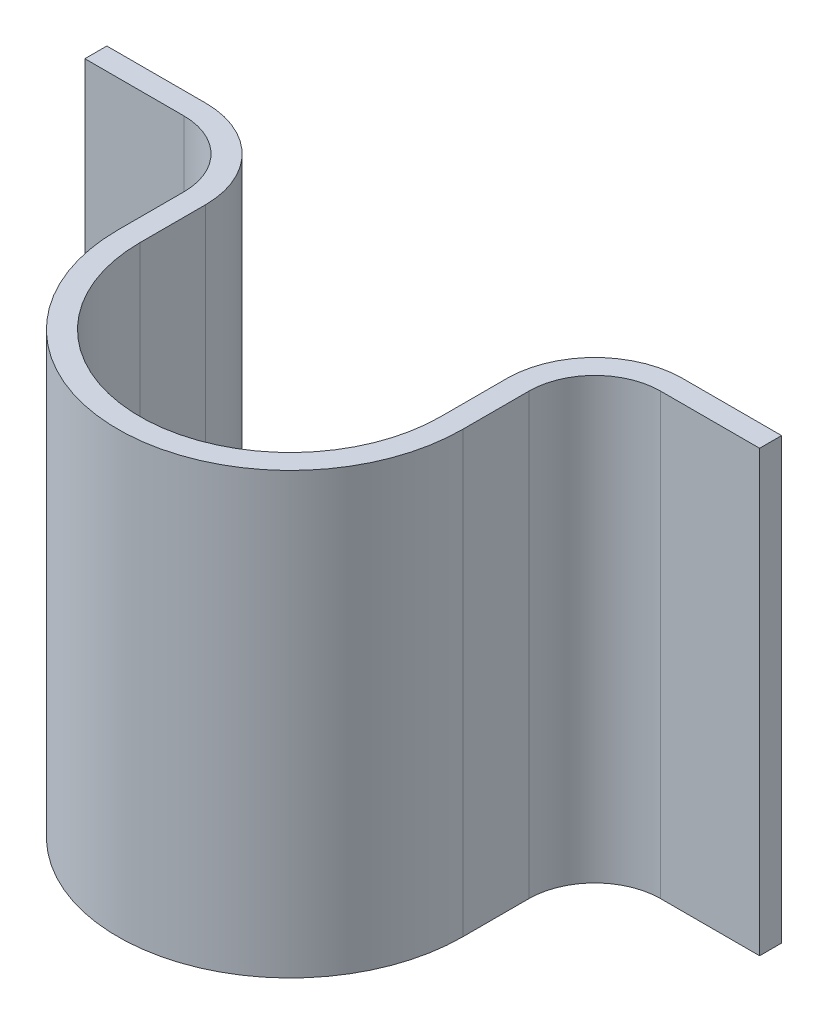
ISO-10303-21;
HEADER;
FILE_DESCRIPTION(('STEP AP214'),'2;1');
FILE_NAME('part.step','',(''),(''),'','','');
FILE_SCHEMA(('AUTOMOTIVE_DESIGN { 1 0 10303 214 1 1 1 1 }'));
ENDSEC;
DATA;
#1=APPLICATION_CONTEXT('core data for automotive mechanical design processes');
#2=APPLICATION_PROTOCOL_DEFINITION('international standard','automotive_design',2000,#1);
#3=PRODUCT_CONTEXT('',#1,'mechanical');
#4=PRODUCT('Part','Part','',(#3));
#5=PRODUCT_RELATED_PRODUCT_CATEGORY('part','',(#4));
#6=PRODUCT_DEFINITION_FORMATION('','',#4);
#7=PRODUCT_DEFINITION_CONTEXT('part definition',#1,'design');
#8=PRODUCT_DEFINITION('design','',#6,#7);
#9=PRODUCT_DEFINITION_SHAPE('','',#8);
#10=(LENGTH_UNIT() NAMED_UNIT(*) SI_UNIT(.MILLI.,.METRE.));
#11=(NAMED_UNIT(*) PLANE_ANGLE_UNIT() SI_UNIT($,.RADIAN.));
#12=(NAMED_UNIT(*) SI_UNIT($,.STERADIAN.) SOLID_ANGLE_UNIT());
#13=UNCERTAINTY_MEASURE_WITH_UNIT(LENGTH_MEASURE(1.E-05),#10,'distance_accuracy_value','');
#14=(GEOMETRIC_REPRESENTATION_CONTEXT(3) GLOBAL_UNCERTAINTY_ASSIGNED_CONTEXT((#13)) GLOBAL_UNIT_ASSIGNED_CONTEXT((#10,
#11,#12)) REPRESENTATION_CONTEXT('',''));
#15=CARTESIAN_POINT('',(0.,0.,0.));
#16=DIRECTION('',(0.,0.,1.));
#17=DIRECTION('',(1.,0.,0.));
#18=AXIS2_PLACEMENT_3D('',#15,#16,#17);
#19=CARTESIAN_POINT('',(0.,20.,0.));
#20=DIRECTION('',(0.,-1.,0.));
#21=DIRECTION('',(0.,0.,-1.));
#22=AXIS2_PLACEMENT_3D('',#19,#20,#21);
#23=CYLINDRICAL_SURFACE('',#22,13.7);
#24=CARTESIAN_POINT('',(0.,-20.,0.));
#25=DIRECTION('',(0.,-1.,0.));
#26=DIRECTION('',(0.,0.,1.));
#27=AXIS2_PLACEMENT_3D('',#24,#25,#26);
#28=CIRCLE('',#27,13.7);
#29=CARTESIAN_POINT('',(13.7,-20.,0.));
#30=VERTEX_POINT('',#29);
#31=CARTESIAN_POINT('',(-13.7,-20.,0.));
#32=VERTEX_POINT('',#31);
#33=EDGE_CURVE('E176',#30,#32,#28,.T.);
#34=ORIENTED_EDGE('',*,*,#33,.T.);
#35=DIRECTION('',(0.,-1.,0.));
#36=VECTOR('',#35,1.);
#37=CARTESIAN_POINT('',(-13.7,20.,0.));
#38=LINE('',#37,#36);
#39=CARTESIAN_POINT('',(-13.7,20.,0.));
#40=VERTEX_POINT('',#39);
#41=EDGE_CURVE('E11',#40,#32,#38,.T.);
#42=ORIENTED_EDGE('',*,*,#41,.F.);
#43=CARTESIAN_POINT('',(0.,20.,0.));
#44=DIRECTION('',(0.,-1.,0.));
#45=DIRECTION('',(0.,0.,1.));
#46=AXIS2_PLACEMENT_3D('',#43,#44,#45);
#47=CIRCLE('',#46,13.7);
#48=CARTESIAN_POINT('',(13.7,20.,0.));
#49=VERTEX_POINT('',#48);
#50=EDGE_CURVE('E206',#49,#40,#47,.T.);
#51=ORIENTED_EDGE('',*,*,#50,.F.);
#52=DIRECTION('',(0.,-1.,0.));
#53=VECTOR('',#52,1.);
#54=CARTESIAN_POINT('',(13.7,20.,0.));
#55=LINE('',#54,#53);
#56=EDGE_CURVE('E172',#49,#30,#55,.T.);
#57=ORIENTED_EDGE('',*,*,#56,.T.);
#58=EDGE_LOOP('',(#34,#42,#51,#57));
#59=FACE_BOUND('',#58,.T.);
#60=ADVANCED_FACE('F32',(#59),#23,.F.);
#61=CARTESIAN_POINT('',(-13.7,20.,0.));
#62=DIRECTION('',(-1.,0.,0.));
#63=DIRECTION('',(0.,0.,1.));
#64=AXIS2_PLACEMENT_3D('',#61,#62,#63);
#65=PLANE('',#64);
#66=DIRECTION('',(0.,0.,-1.));
#67=VECTOR('',#66,1.);
#68=CARTESIAN_POINT('',(-13.7,-20.,0.));
#69=LINE('',#68,#67);
#70=CARTESIAN_POINT('',(-13.7,-20.,-6.));
#71=VERTEX_POINT('',#70);
#72=EDGE_CURVE('E179',#32,#71,#69,.T.);
#73=ORIENTED_EDGE('',*,*,#72,.T.);
#74=DIRECTION('',(0.,-1.,0.));
#75=VECTOR('',#74,1.);
#76=CARTESIAN_POINT('',(-13.7,20.,-6.));
#77=LINE('',#76,#75);
#78=CARTESIAN_POINT('',(-13.7,20.,-6.));
#79=VERTEX_POINT('',#78);
#80=EDGE_CURVE('E40',#79,#71,#77,.T.);
#81=ORIENTED_EDGE('',*,*,#80,.F.);
#82=DIRECTION('',(0.,0.,-1.));
#83=VECTOR('',#82,1.);
#84=CARTESIAN_POINT('',(-13.7,20.,0.));
#85=LINE('',#84,#83);
#86=EDGE_CURVE('E115',#40,#79,#85,.T.);
#87=ORIENTED_EDGE('',*,*,#86,.F.);
#88=ORIENTED_EDGE('',*,*,#41,.T.);
#89=EDGE_LOOP('',(#73,#81,#87,#88));
#90=FACE_BOUND('',#89,.T.);
#91=ADVANCED_FACE('F304',(#90),#65,.F.);
#92=CARTESIAN_POINT('',(-21.7,20.,-5.99999999999999));
#93=DIRECTION('',(0.,-1.,0.));
#94=DIRECTION('',(0.,0.,-1.));
#95=AXIS2_PLACEMENT_3D('',#92,#93,#94);
#96=CYLINDRICAL_SURFACE('',#95,8.);
#97=CARTESIAN_POINT('',(-21.7,-20.,-5.99999999999999));
#98=DIRECTION('',(0.,1.,0.));
#99=DIRECTION('',(0.,0.,1.));
#100=AXIS2_PLACEMENT_3D('',#97,#98,#99);
#101=CIRCLE('',#100,8.);
#102=CARTESIAN_POINT('',(-21.7,-20.,-14.));
#103=VERTEX_POINT('',#102);
#104=EDGE_CURVE('E181',#71,#103,#101,.T.);
#105=ORIENTED_EDGE('',*,*,#104,.T.);
#106=DIRECTION('',(0.,-1.,0.));
#107=VECTOR('',#106,1.);
#108=CARTESIAN_POINT('',(-21.7,20.,-14.));
#109=LINE('',#108,#107);
#110=CARTESIAN_POINT('',(-21.7,20.,-14.));
#111=VERTEX_POINT('',#110);
#112=EDGE_CURVE('E237',#111,#103,#109,.T.);
#113=ORIENTED_EDGE('',*,*,#112,.F.);
#114=CARTESIAN_POINT('',(-21.7,20.,-5.99999999999999));
#115=DIRECTION('',(0.,1.,0.));
#116=DIRECTION('',(0.,0.,1.));
#117=AXIS2_PLACEMENT_3D('',#114,#115,#116);
#118=CIRCLE('',#117,8.);
#119=EDGE_CURVE('E245',#79,#111,#118,.T.);
#120=ORIENTED_EDGE('',*,*,#119,.F.);
#121=ORIENTED_EDGE('',*,*,#80,.T.);
#122=EDGE_LOOP('',(#105,#113,#120,#121));
#123=FACE_BOUND('',#122,.T.);
#124=ADVANCED_FACE('F243',(#123),#96,.T.);
#125=CARTESIAN_POINT('',(-21.7,20.,-14.));
#126=DIRECTION('',(0.,0.,1.));
#127=DIRECTION('',(1.,0.,0.));
#128=AXIS2_PLACEMENT_3D('',#125,#126,#127);
#129=PLANE('',#128);
#130=DIRECTION('',(-1.,0.,0.));
#131=VECTOR('',#130,1.);
#132=CARTESIAN_POINT('',(-21.7,-20.,-14.));
#133=LINE('',#132,#131);
#134=CARTESIAN_POINT('',(-30.7,-20.,-14.));
#135=VERTEX_POINT('',#134);
#136=EDGE_CURVE('E183',#103,#135,#133,.T.);
#137=ORIENTED_EDGE('',*,*,#136,.T.);
#138=DIRECTION('',(0.,-1.,0.));
#139=VECTOR('',#138,1.);
#140=CARTESIAN_POINT('',(-30.7,20.,-14.));
#141=LINE('',#140,#139);
#142=CARTESIAN_POINT('',(-30.7,20.,-14.));
#143=VERTEX_POINT('',#142);
#144=EDGE_CURVE('E234',#143,#135,#141,.T.);
#145=ORIENTED_EDGE('',*,*,#144,.F.);
#146=DIRECTION('',(-1.,0.,0.));
#147=VECTOR('',#146,1.);
#148=CARTESIAN_POINT('',(-21.7,20.,-14.));
#149=LINE('',#148,#147);
#150=EDGE_CURVE('E263',#111,#143,#149,.T.);
#151=ORIENTED_EDGE('',*,*,#150,.F.);
#152=ORIENTED_EDGE('',*,*,#112,.T.);
#153=EDGE_LOOP('',(#137,#145,#151,#152));
#154=FACE_BOUND('',#153,.T.);
#155=ADVANCED_FACE('F254',(#154),#129,.F.);
#156=CARTESIAN_POINT('',(-30.7,20.,-14.));
#157=DIRECTION('',(1.,0.,0.));
#158=DIRECTION('',(0.,0.,-1.));
#159=AXIS2_PLACEMENT_3D('',#156,#157,#158);
#160=PLANE('',#159);
#161=DIRECTION('',(0.,0.,1.));
#162=VECTOR('',#161,1.);
#163=CARTESIAN_POINT('',(-30.7,-20.,-14.));
#164=LINE('',#163,#162);
#165=CARTESIAN_POINT('',(-30.7,-20.,-12.));
#166=VERTEX_POINT('',#165);
#167=EDGE_CURVE('E185',#135,#166,#164,.T.);
#168=ORIENTED_EDGE('',*,*,#167,.T.);
#169=DIRECTION('',(0.,-1.,0.));
#170=VECTOR('',#169,1.);
#171=CARTESIAN_POINT('',(-30.7,20.,-12.));
#172=LINE('',#171,#170);
#173=CARTESIAN_POINT('',(-30.7,20.,-12.));
#174=VERTEX_POINT('',#173);
#175=EDGE_CURVE('E231',#174,#166,#172,.T.);
#176=ORIENTED_EDGE('',*,*,#175,.F.);
#177=DIRECTION('',(0.,0.,1.));
#178=VECTOR('',#177,1.);
#179=CARTESIAN_POINT('',(-30.7,20.,-14.));
#180=LINE('',#179,#178);
#181=EDGE_CURVE('E260',#143,#174,#180,.T.);
#182=ORIENTED_EDGE('',*,*,#181,.F.);
#183=ORIENTED_EDGE('',*,*,#144,.T.);
#184=EDGE_LOOP('',(#168,#176,#182,#183));
#185=FACE_BOUND('',#184,.T.);
#186=ADVANCED_FACE('F258',(#185),#160,.F.);
#187=CARTESIAN_POINT('',(-21.7,20.,-12.));
#188=DIRECTION('',(0.,0.,-1.));
#189=DIRECTION('',(-1.,0.,0.));
#190=AXIS2_PLACEMENT_3D('',#187,#188,#189);
#191=PLANE('',#190);
#192=DIRECTION('',(1.,0.,0.));
#193=VECTOR('',#192,1.);
#194=CARTESIAN_POINT('',(-21.7,-20.,-12.));
#195=LINE('',#194,#193);
#196=CARTESIAN_POINT('',(-21.7,-20.,-12.));
#197=VERTEX_POINT('',#196);
#198=EDGE_CURVE('E187',#166,#197,#195,.T.);
#199=ORIENTED_EDGE('',*,*,#198,.T.);
#200=DIRECTION('',(0.,-1.,0.));
#201=VECTOR('',#200,1.);
#202=CARTESIAN_POINT('',(-21.7,20.,-12.));
#203=LINE('',#202,#201);
#204=CARTESIAN_POINT('',(-21.7,20.,-12.));
#205=VERTEX_POINT('',#204);
#206=EDGE_CURVE('E228',#205,#197,#203,.T.);
#207=ORIENTED_EDGE('',*,*,#206,.F.);
#208=DIRECTION('',(1.,0.,0.));
#209=VECTOR('',#208,1.);
#210=CARTESIAN_POINT('',(-21.7,20.,-12.));
#211=LINE('',#210,#209);
#212=EDGE_CURVE('E262',#174,#205,#211,.T.);
#213=ORIENTED_EDGE('',*,*,#212,.F.);
#214=ORIENTED_EDGE('',*,*,#175,.T.);
#215=EDGE_LOOP('',(#199,#207,#213,#214));
#216=FACE_BOUND('',#215,.T.);
#217=ADVANCED_FACE('F317',(#216),#191,.F.);
#218=CARTESIAN_POINT('',(-21.7,20.,-5.99999999999999));
#219=DIRECTION('',(0.,-1.,0.));
#220=DIRECTION('',(0.,0.,-1.));
#221=AXIS2_PLACEMENT_3D('',#218,#219,#220);
#222=CYLINDRICAL_SURFACE('',#221,6.);
#223=CARTESIAN_POINT('',(-21.7,-20.,-5.99999999999999));
#224=DIRECTION('',(0.,-1.,0.));
#225=DIRECTION('',(0.,0.,1.));
#226=AXIS2_PLACEMENT_3D('',#223,#224,#225);
#227=CIRCLE('',#226,6.);
#228=CARTESIAN_POINT('',(-15.7,-20.,-6.));
#229=VERTEX_POINT('',#228);
#230=EDGE_CURVE('E189',#197,#229,#227,.T.);
#231=ORIENTED_EDGE('',*,*,#230,.T.);
#232=DIRECTION('',(0.,-1.,0.));
#233=VECTOR('',#232,1.);
#234=CARTESIAN_POINT('',(-15.7,20.,-6.));
#235=LINE('',#234,#233);
#236=CARTESIAN_POINT('',(-15.7,20.,-6.));
#237=VERTEX_POINT('',#236);
#238=EDGE_CURVE('E225',#237,#229,#235,.T.);
#239=ORIENTED_EDGE('',*,*,#238,.F.);
#240=CARTESIAN_POINT('',(-21.7,20.,-5.99999999999999));
#241=DIRECTION('',(0.,-1.,0.));
#242=DIRECTION('',(0.,0.,1.));
#243=AXIS2_PLACEMENT_3D('',#240,#241,#242);
#244=CIRCLE('',#243,6.);
#245=EDGE_CURVE('E265',#205,#237,#244,.T.);
#246=ORIENTED_EDGE('',*,*,#245,.F.);
#247=ORIENTED_EDGE('',*,*,#206,.T.);
#248=EDGE_LOOP('',(#231,#239,#246,#247));
#249=FACE_BOUND('',#248,.T.);
#250=ADVANCED_FACE('F320',(#249),#222,.F.);
#251=CARTESIAN_POINT('',(-15.7,20.,0.));
#252=DIRECTION('',(1.,0.,0.));
#253=DIRECTION('',(0.,0.,-1.));
#254=AXIS2_PLACEMENT_3D('',#251,#252,#253);
#255=PLANE('',#254);
#256=DIRECTION('',(0.,0.,1.));
#257=VECTOR('',#256,1.);
#258=CARTESIAN_POINT('',(-15.7,-20.,0.));
#259=LINE('',#258,#257);
#260=CARTESIAN_POINT('',(-15.7,-20.,0.));
#261=VERTEX_POINT('',#260);
#262=EDGE_CURVE('E191',#229,#261,#259,.T.);
#263=ORIENTED_EDGE('',*,*,#262,.T.);
#264=DIRECTION('',(0.,-1.,0.));
#265=VECTOR('',#264,1.);
#266=CARTESIAN_POINT('',(-15.7,20.,0.));
#267=LINE('',#266,#265);
#268=CARTESIAN_POINT('',(-15.7,20.,0.));
#269=VERTEX_POINT('',#268);
#270=EDGE_CURVE('E222',#269,#261,#267,.T.);
#271=ORIENTED_EDGE('',*,*,#270,.F.);
#272=DIRECTION('',(0.,0.,1.));
#273=VECTOR('',#272,1.);
#274=CARTESIAN_POINT('',(-15.7,20.,0.));
#275=LINE('',#274,#273);
#276=EDGE_CURVE('E271',#237,#269,#275,.T.);
#277=ORIENTED_EDGE('',*,*,#276,.F.);
#278=ORIENTED_EDGE('',*,*,#238,.T.);
#279=EDGE_LOOP('',(#263,#271,#277,#278));
#280=FACE_BOUND('',#279,.T.);
#281=ADVANCED_FACE('F324',(#280),#255,.F.);
#282=CARTESIAN_POINT('',(0.,20.,0.));
#283=DIRECTION('',(0.,-1.,0.));
#284=DIRECTION('',(0.,0.,-1.));
#285=AXIS2_PLACEMENT_3D('',#282,#283,#284);
#286=CYLINDRICAL_SURFACE('',#285,15.7);
#287=CARTESIAN_POINT('',(0.,-20.,0.));
#288=DIRECTION('',(0.,1.,0.));
#289=DIRECTION('',(0.,0.,1.));
#290=AXIS2_PLACEMENT_3D('',#287,#288,#289);
#291=CIRCLE('',#290,15.7);
#292=CARTESIAN_POINT('',(15.7,-20.,0.));
#293=VERTEX_POINT('',#292);
#294=EDGE_CURVE('E193',#261,#293,#291,.T.);
#295=ORIENTED_EDGE('',*,*,#294,.T.);
#296=DIRECTION('',(0.,-1.,0.));
#297=VECTOR('',#296,1.);
#298=CARTESIAN_POINT('',(15.7,20.,0.));
#299=LINE('',#298,#297);
#300=CARTESIAN_POINT('',(15.7,20.,0.));
#301=VERTEX_POINT('',#300);
#302=EDGE_CURVE('E219',#301,#293,#299,.T.);
#303=ORIENTED_EDGE('',*,*,#302,.F.);
#304=CARTESIAN_POINT('',(0.,20.,0.));
#305=DIRECTION('',(0.,1.,0.));
#306=DIRECTION('',(0.,0.,1.));
#307=AXIS2_PLACEMENT_3D('',#304,#305,#306);
#308=CIRCLE('',#307,15.7);
#309=EDGE_CURVE('E273',#269,#301,#308,.T.);
#310=ORIENTED_EDGE('',*,*,#309,.F.);
#311=ORIENTED_EDGE('',*,*,#270,.T.);
#312=EDGE_LOOP('',(#295,#303,#310,#311));
#313=FACE_BOUND('',#312,.T.);
#314=ADVANCED_FACE('F328',(#313),#286,.T.);
#315=CARTESIAN_POINT('',(15.7,20.,0.));
#316=DIRECTION('',(-1.,0.,0.));
#317=DIRECTION('',(0.,0.,1.));
#318=AXIS2_PLACEMENT_3D('',#315,#316,#317);
#319=PLANE('',#318);
#320=DIRECTION('',(0.,0.,-1.));
#321=VECTOR('',#320,1.);
#322=CARTESIAN_POINT('',(15.7,-20.,0.));
#323=LINE('',#322,#321);
#324=CARTESIAN_POINT('',(15.7,-20.,-6.));
#325=VERTEX_POINT('',#324);
#326=EDGE_CURVE('E195',#293,#325,#323,.T.);
#327=ORIENTED_EDGE('',*,*,#326,.T.);
#328=DIRECTION('',(0.,-1.,0.));
#329=VECTOR('',#328,1.);
#330=CARTESIAN_POINT('',(15.7,20.,-6.));
#331=LINE('',#330,#329);
#332=CARTESIAN_POINT('',(15.7,20.,-6.));
#333=VERTEX_POINT('',#332);
#334=EDGE_CURVE('E216',#333,#325,#331,.T.);
#335=ORIENTED_EDGE('',*,*,#334,.F.);
#336=DIRECTION('',(0.,0.,-1.));
#337=VECTOR('',#336,1.);
#338=CARTESIAN_POINT('',(15.7,20.,0.));
#339=LINE('',#338,#337);
#340=EDGE_CURVE('E275',#301,#333,#339,.T.);
#341=ORIENTED_EDGE('',*,*,#340,.F.);
#342=ORIENTED_EDGE('',*,*,#302,.T.);
#343=EDGE_LOOP('',(#327,#335,#341,#342));
#344=FACE_BOUND('',#343,.T.);
#345=ADVANCED_FACE('F332',(#344),#319,.F.);
#346=CARTESIAN_POINT('',(21.7,20.,-6.));
#347=DIRECTION('',(0.,-1.,0.));
#348=DIRECTION('',(0.,0.,-1.));
#349=AXIS2_PLACEMENT_3D('',#346,#347,#348);
#350=CYLINDRICAL_SURFACE('',#349,6.);
#351=CARTESIAN_POINT('',(21.7,-20.,-6.));
#352=DIRECTION('',(0.,-1.,0.));
#353=DIRECTION('',(0.,0.,-1.));
#354=AXIS2_PLACEMENT_3D('',#351,#352,#353);
#355=CIRCLE('',#354,6.);
#356=CARTESIAN_POINT('',(21.7,-20.,-12.));
#357=VERTEX_POINT('',#356);
#358=EDGE_CURVE('E197',#325,#357,#355,.T.);
#359=ORIENTED_EDGE('',*,*,#358,.T.);
#360=DIRECTION('',(0.,-1.,0.));
#361=VECTOR('',#360,1.);
#362=CARTESIAN_POINT('',(21.7,20.,-12.));
#363=LINE('',#362,#361);
#364=CARTESIAN_POINT('',(21.7,20.,-12.));
#365=VERTEX_POINT('',#364);
#366=EDGE_CURVE('E213',#365,#357,#363,.T.);
#367=ORIENTED_EDGE('',*,*,#366,.F.);
#368=CARTESIAN_POINT('',(21.7,20.,-6.));
#369=DIRECTION('',(0.,-1.,0.));
#370=DIRECTION('',(0.,0.,-1.));
#371=AXIS2_PLACEMENT_3D('',#368,#369,#370);
#372=CIRCLE('',#371,6.);
#373=EDGE_CURVE('E277',#333,#365,#372,.T.);
#374=ORIENTED_EDGE('',*,*,#373,.F.);
#375=ORIENTED_EDGE('',*,*,#334,.T.);
#376=EDGE_LOOP('',(#359,#367,#374,#375));
#377=FACE_BOUND('',#376,.T.);
#378=ADVANCED_FACE('F336',(#377),#350,.F.);
#379=CARTESIAN_POINT('',(21.7,20.,-12.));
#380=DIRECTION('',(0.,0.,-1.));
#381=DIRECTION('',(-1.,0.,0.));
#382=AXIS2_PLACEMENT_3D('',#379,#380,#381);
#383=PLANE('',#382);
#384=DIRECTION('',(1.,0.,0.));
#385=VECTOR('',#384,1.);
#386=CARTESIAN_POINT('',(21.7,-20.,-12.));
#387=LINE('',#386,#385);
#388=CARTESIAN_POINT('',(30.7,-20.,-12.));
#389=VERTEX_POINT('',#388);
#390=EDGE_CURVE('E199',#357,#389,#387,.T.);
#391=ORIENTED_EDGE('',*,*,#390,.T.);
#392=DIRECTION('',(0.,-1.,0.));
#393=VECTOR('',#392,1.);
#394=CARTESIAN_POINT('',(30.7,20.,-12.));
#395=LINE('',#394,#393);
#396=CARTESIAN_POINT('',(30.7,20.,-12.));
#397=VERTEX_POINT('',#396);
#398=EDGE_CURVE('E210',#397,#389,#395,.T.);
#399=ORIENTED_EDGE('',*,*,#398,.F.);
#400=DIRECTION('',(1.,0.,0.));
#401=VECTOR('',#400,1.);
#402=CARTESIAN_POINT('',(21.7,20.,-12.));
#403=LINE('',#402,#401);
#404=EDGE_CURVE('E279',#365,#397,#403,.T.);
#405=ORIENTED_EDGE('',*,*,#404,.F.);
#406=ORIENTED_EDGE('',*,*,#366,.T.);
#407=EDGE_LOOP('',(#391,#399,#405,#406));
#408=FACE_BOUND('',#407,.T.);
#409=ADVANCED_FACE('F285',(#408),#383,.F.);
#410=CARTESIAN_POINT('',(30.7,20.,-14.));
#411=DIRECTION('',(-1.,0.,0.));
#412=DIRECTION('',(0.,0.,1.));
#413=AXIS2_PLACEMENT_3D('',#410,#411,#412);
#414=PLANE('',#413);
#415=DIRECTION('',(0.,0.,-1.));
#416=VECTOR('',#415,1.);
#417=CARTESIAN_POINT('',(30.7,-20.,-14.));
#418=LINE('',#417,#416);
#419=CARTESIAN_POINT('',(30.7,-20.,-14.));
#420=VERTEX_POINT('',#419);
#421=EDGE_CURVE('E201',#389,#420,#418,.T.);
#422=ORIENTED_EDGE('',*,*,#421,.T.);
#423=DIRECTION('',(0.,-1.,0.));
#424=VECTOR('',#423,1.);
#425=CARTESIAN_POINT('',(30.7,20.,-14.));
#426=LINE('',#425,#424);
#427=CARTESIAN_POINT('',(30.7,20.,-14.));
#428=VERTEX_POINT('',#427);
#429=EDGE_CURVE('E167',#428,#420,#426,.T.);
#430=ORIENTED_EDGE('',*,*,#429,.F.);
#431=DIRECTION('',(0.,0.,-1.));
#432=VECTOR('',#431,1.);
#433=CARTESIAN_POINT('',(30.7,20.,-14.));
#434=LINE('',#433,#432);
#435=EDGE_CURVE('E158',#397,#428,#434,.T.);
#436=ORIENTED_EDGE('',*,*,#435,.F.);
#437=ORIENTED_EDGE('',*,*,#398,.T.);
#438=EDGE_LOOP('',(#422,#430,#436,#437));
#439=FACE_BOUND('',#438,.T.);
#440=ADVANCED_FACE('F289',(#439),#414,.F.);
#441=CARTESIAN_POINT('',(21.7,20.,-14.));
#442=DIRECTION('',(0.,0.,1.));
#443=DIRECTION('',(1.,0.,0.));
#444=AXIS2_PLACEMENT_3D('',#441,#442,#443);
#445=PLANE('',#444);
#446=DIRECTION('',(-1.,0.,0.));
#447=VECTOR('',#446,1.);
#448=CARTESIAN_POINT('',(21.7,-20.,-14.));
#449=LINE('',#448,#447);
#450=CARTESIAN_POINT('',(21.7,-20.,-14.));
#451=VERTEX_POINT('',#450);
#452=EDGE_CURVE('E166',#420,#451,#449,.T.);
#453=ORIENTED_EDGE('',*,*,#452,.T.);
#454=DIRECTION('',(0.,-1.,0.));
#455=VECTOR('',#454,1.);
#456=CARTESIAN_POINT('',(21.7,20.,-14.));
#457=LINE('',#456,#455);
#458=CARTESIAN_POINT('',(21.7,20.,-14.));
#459=VERTEX_POINT('',#458);
#460=EDGE_CURVE('E163',#459,#451,#457,.T.);
#461=ORIENTED_EDGE('',*,*,#460,.F.);
#462=DIRECTION('',(-1.,0.,0.));
#463=VECTOR('',#462,1.);
#464=CARTESIAN_POINT('',(21.7,20.,-14.));
#465=LINE('',#464,#463);
#466=EDGE_CURVE('E152',#428,#459,#465,.T.);
#467=ORIENTED_EDGE('',*,*,#466,.F.);
#468=ORIENTED_EDGE('',*,*,#429,.T.);
#469=EDGE_LOOP('',(#453,#461,#467,#468));
#470=FACE_BOUND('',#469,.T.);
#471=ADVANCED_FACE('F164',(#470),#445,.F.);
#472=CARTESIAN_POINT('',(21.7,20.,-6.));
#473=DIRECTION('',(0.,-1.,0.));
#474=DIRECTION('',(0.,0.,-1.));
#475=AXIS2_PLACEMENT_3D('',#472,#473,#474);
#476=CYLINDRICAL_SURFACE('',#475,8.);
#477=CARTESIAN_POINT('',(21.7,-20.,-6.));
#478=DIRECTION('',(0.,1.,0.));
#479=DIRECTION('',(0.,0.,-1.));
#480=AXIS2_PLACEMENT_3D('',#477,#478,#479);
#481=CIRCLE('',#480,8.);
#482=CARTESIAN_POINT('',(13.7,-20.,-6.));
#483=VERTEX_POINT('',#482);
#484=EDGE_CURVE('E101',#451,#483,#481,.T.);
#485=ORIENTED_EDGE('',*,*,#484,.T.);
#486=DIRECTION('',(0.,-1.,0.));
#487=VECTOR('',#486,1.);
#488=CARTESIAN_POINT('',(13.7,20.,-6.));
#489=LINE('',#488,#487);
#490=CARTESIAN_POINT('',(13.7,20.,-6.));
#491=VERTEX_POINT('',#490);
#492=EDGE_CURVE('E168',#491,#483,#489,.T.);
#493=ORIENTED_EDGE('',*,*,#492,.F.);
#494=CARTESIAN_POINT('',(21.7,20.,-6.));
#495=DIRECTION('',(0.,1.,0.));
#496=DIRECTION('',(0.,0.,-1.));
#497=AXIS2_PLACEMENT_3D('',#494,#495,#496);
#498=CIRCLE('',#497,8.);
#499=EDGE_CURVE('E156',#459,#491,#498,.T.);
#500=ORIENTED_EDGE('',*,*,#499,.F.);
#501=ORIENTED_EDGE('',*,*,#460,.T.);
#502=EDGE_LOOP('',(#485,#493,#500,#501));
#503=FACE_BOUND('',#502,.T.);
#504=ADVANCED_FACE('F170',(#503),#476,.T.);
#505=CARTESIAN_POINT('',(13.7,20.,0.));
#506=DIRECTION('',(1.,0.,0.));
#507=DIRECTION('',(0.,0.,-1.));
#508=AXIS2_PLACEMENT_3D('',#505,#506,#507);
#509=PLANE('',#508);
#510=DIRECTION('',(0.,0.,1.));
#511=VECTOR('',#510,1.);
#512=CARTESIAN_POINT('',(13.7,-20.,0.));
#513=LINE('',#512,#511);
#514=EDGE_CURVE('E107',#483,#30,#513,.T.);
#515=ORIENTED_EDGE('',*,*,#514,.T.);
#516=ORIENTED_EDGE('',*,*,#56,.F.);
#517=DIRECTION('',(0.,0.,1.));
#518=VECTOR('',#517,1.);
#519=CARTESIAN_POINT('',(13.7,20.,0.));
#520=LINE('',#519,#518);
#521=EDGE_CURVE('E48',#491,#49,#520,.T.);
#522=ORIENTED_EDGE('',*,*,#521,.F.);
#523=ORIENTED_EDGE('',*,*,#492,.T.);
#524=EDGE_LOOP('',(#515,#516,#522,#523));
#525=FACE_BOUND('',#524,.T.);
#526=ADVANCED_FACE('F293',(#525),#509,.F.);
#527=CARTESIAN_POINT('',(0.,20.,0.));
#528=DIRECTION('',(0.,1.,0.));
#529=DIRECTION('',(0.,0.,1.));
#530=AXIS2_PLACEMENT_3D('',#527,#528,#529);
#531=PLANE('',#530);
#532=ORIENTED_EDGE('',*,*,#50,.T.);
#533=ORIENTED_EDGE('',*,*,#86,.T.);
#534=ORIENTED_EDGE('',*,*,#119,.T.);
#535=ORIENTED_EDGE('',*,*,#150,.T.);
#536=ORIENTED_EDGE('',*,*,#181,.T.);
#537=ORIENTED_EDGE('',*,*,#212,.T.);
#538=ORIENTED_EDGE('',*,*,#245,.T.);
#539=ORIENTED_EDGE('',*,*,#276,.T.);
#540=ORIENTED_EDGE('',*,*,#309,.T.);
#541=ORIENTED_EDGE('',*,*,#340,.T.);
#542=ORIENTED_EDGE('',*,*,#373,.T.);
#543=ORIENTED_EDGE('',*,*,#404,.T.);
#544=ORIENTED_EDGE('',*,*,#435,.T.);
#545=ORIENTED_EDGE('',*,*,#466,.T.);
#546=ORIENTED_EDGE('',*,*,#499,.T.);
#547=ORIENTED_EDGE('',*,*,#521,.T.);
#548=EDGE_LOOP('',(#532,#533,#534,#535,#536,#537,#538,#539,#540,#541,#542,#543,#544,#545,#546,#547));
#549=FACE_BOUND('',#548,.T.);
#550=ADVANCED_FACE('F154',(#549),#531,.T.);
#551=CARTESIAN_POINT('',(0.,-20.,0.));
#552=DIRECTION('',(0.,1.,0.));
#553=DIRECTION('',(0.,0.,1.));
#554=AXIS2_PLACEMENT_3D('',#551,#552,#553);
#555=PLANE('',#554);
#556=ORIENTED_EDGE('',*,*,#33,.F.);
#557=ORIENTED_EDGE('',*,*,#514,.F.);
#558=ORIENTED_EDGE('',*,*,#484,.F.);
#559=ORIENTED_EDGE('',*,*,#452,.F.);
#560=ORIENTED_EDGE('',*,*,#421,.F.);
#561=ORIENTED_EDGE('',*,*,#390,.F.);
#562=ORIENTED_EDGE('',*,*,#358,.F.);
#563=ORIENTED_EDGE('',*,*,#326,.F.);
#564=ORIENTED_EDGE('',*,*,#294,.F.);
#565=ORIENTED_EDGE('',*,*,#262,.F.);
#566=ORIENTED_EDGE('',*,*,#230,.F.);
#567=ORIENTED_EDGE('',*,*,#198,.F.);
#568=ORIENTED_EDGE('',*,*,#167,.F.);
#569=ORIENTED_EDGE('',*,*,#136,.F.);
#570=ORIENTED_EDGE('',*,*,#104,.F.);
#571=ORIENTED_EDGE('',*,*,#72,.F.);
#572=EDGE_LOOP('',(#556,#557,#558,#559,#560,#561,#562,#563,#564,#565,#566,#567,#568,#569,#570,#571));
#573=FACE_BOUND('',#572,.T.);
#574=ADVANCED_FACE('F249',(#573),#555,.F.);
#575=CLOSED_SHELL('',(#60,#91,#124,#155,#186,#217,#250,#281,#314,#345,#378,#409,#440,#471,#504,
#526,#550,#574));
#576=MANIFOLD_SOLID_BREP('B2',#575);
#577=ADVANCED_BREP_SHAPE_REPRESENTATION('',(#18,#576),#14);
#578=SHAPE_DEFINITION_REPRESENTATION(#9,#577);
ENDSEC;
END-ISO-10303-21;
